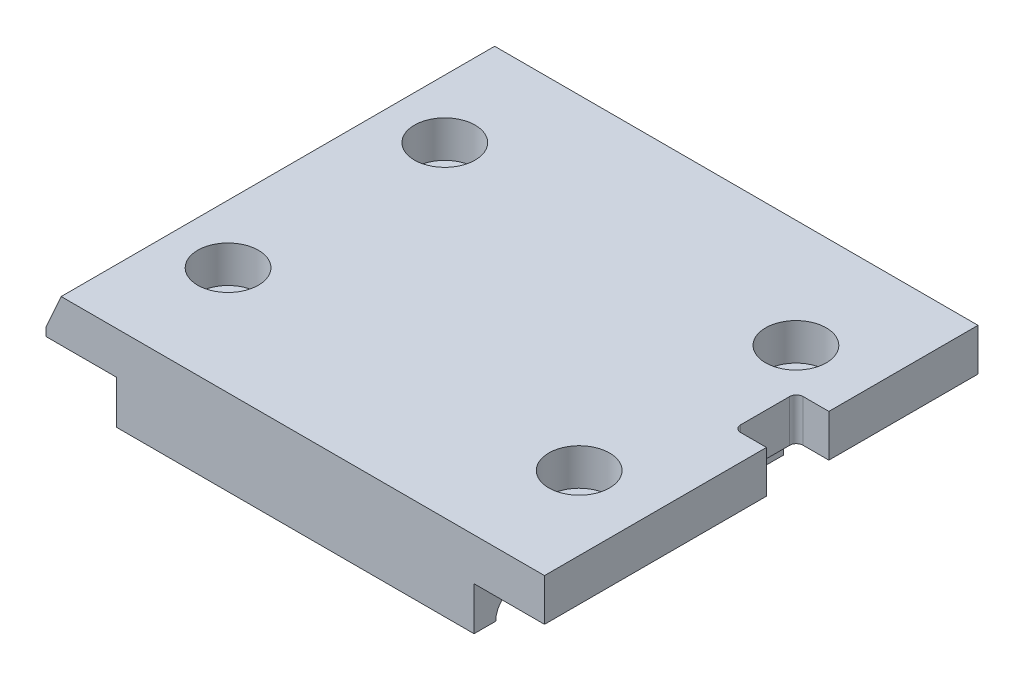
ISO-10303-21;
HEADER;
FILE_DESCRIPTION(('STEP AP214'),'2;1');
FILE_NAME('part.step','',(''),(''),'','','');
FILE_SCHEMA(('AUTOMOTIVE_DESIGN { 1 0 10303 214 1 1 1 1 }'));
ENDSEC;
DATA;
#1=APPLICATION_CONTEXT('core data for automotive mechanical design processes');
#2=APPLICATION_PROTOCOL_DEFINITION('international standard','automotive_design',2000,#1);
#3=PRODUCT_CONTEXT('',#1,'mechanical');
#4=PRODUCT('Part','Part','',(#3));
#5=PRODUCT_RELATED_PRODUCT_CATEGORY('part','',(#4));
#6=PRODUCT_DEFINITION_FORMATION('','',#4);
#7=PRODUCT_DEFINITION_CONTEXT('part definition',#1,'design');
#8=PRODUCT_DEFINITION('design','',#6,#7);
#9=PRODUCT_DEFINITION_SHAPE('','',#8);
#10=(LENGTH_UNIT() NAMED_UNIT(*) SI_UNIT(.MILLI.,.METRE.));
#11=(NAMED_UNIT(*) PLANE_ANGLE_UNIT() SI_UNIT($,.RADIAN.));
#12=(NAMED_UNIT(*) SI_UNIT($,.STERADIAN.) SOLID_ANGLE_UNIT());
#13=UNCERTAINTY_MEASURE_WITH_UNIT(LENGTH_MEASURE(1.E-05),#10,'distance_accuracy_value','');
#14=(GEOMETRIC_REPRESENTATION_CONTEXT(3) GLOBAL_UNCERTAINTY_ASSIGNED_CONTEXT((#13)) GLOBAL_UNIT_ASSIGNED_CONTEXT((#10,
#11,#12)) REPRESENTATION_CONTEXT('',''));
#15=CARTESIAN_POINT('',(0.,0.,0.));
#16=DIRECTION('',(0.,0.,1.));
#17=DIRECTION('',(1.,0.,0.));
#18=AXIS2_PLACEMENT_3D('',#15,#16,#17);
#19=CARTESIAN_POINT('',(23.,-36.1123422402632,-20.));
#20=DIRECTION('',(1.,0.,0.));
#21=DIRECTION('',(0.,0.,-1.));
#22=AXIS2_PLACEMENT_3D('',#19,#20,#21);
#23=PLANE('',#22);
#24=DIRECTION('',(0.,1.,0.));
#25=VECTOR('',#24,1.);
#26=CARTESIAN_POINT('',(23.,4.,-0.479999999999997));
#27=LINE('',#26,#25);
#28=CARTESIAN_POINT('',(23.,4.,-0.479999999999997));
#29=VERTEX_POINT('',#28);
#30=CARTESIAN_POINT('',(23.,7.9,-0.479999999999997));
#31=VERTEX_POINT('',#30);
#32=EDGE_CURVE('E293',#29,#31,#27,.T.);
#33=ORIENTED_EDGE('',*,*,#32,.T.);
#34=DIRECTION('',(0.,0.,-1.));
#35=VECTOR('',#34,1.);
#36=CARTESIAN_POINT('',(23.,7.9,-20.));
#37=LINE('',#36,#35);
#38=CARTESIAN_POINT('',(23.,7.9,20.));
#39=VERTEX_POINT('',#38);
#40=EDGE_CURVE('E311',#39,#31,#37,.T.);
#41=ORIENTED_EDGE('',*,*,#40,.F.);
#42=DIRECTION('',(0.,1.,0.));
#43=VECTOR('',#42,1.);
#44=CARTESIAN_POINT('',(23.,-36.1123422402632,20.));
#45=LINE('',#44,#43);
#46=CARTESIAN_POINT('',(23.,4.,20.));
#47=VERTEX_POINT('',#46);
#48=EDGE_CURVE('E303',#47,#39,#45,.T.);
#49=ORIENTED_EDGE('',*,*,#48,.F.);
#50=DIRECTION('',(0.,0.,-1.));
#51=VECTOR('',#50,1.);
#52=CARTESIAN_POINT('',(23.,4.,-20.));
#53=LINE('',#52,#51);
#54=EDGE_CURVE('E282',#47,#29,#53,.T.);
#55=ORIENTED_EDGE('',*,*,#54,.T.);
#56=EDGE_LOOP('',(#33,#41,#49,#55));
#57=FACE_BOUND('',#56,.T.);
#58=ADVANCED_FACE('F97',(#57),#23,.T.);
#59=CARTESIAN_POINT('',(0.,0.,0.));
#60=DIRECTION('',(0.,1.,0.));
#61=DIRECTION('',(0.,0.,1.));
#62=AXIS2_PLACEMENT_3D('',#59,#60,#61);
#63=PLANE('',#62);
#64=DIRECTION('',(0.,0.,-1.));
#65=VECTOR('',#64,1.);
#66=CARTESIAN_POINT('',(-16.5,0.,0.));
#67=LINE('',#66,#65);
#68=CARTESIAN_POINT('',(-16.5,0.,20.));
#69=VERTEX_POINT('',#68);
#70=CARTESIAN_POINT('',(-16.5,0.,18.));
#71=VERTEX_POINT('',#70);
#72=EDGE_CURVE('E456',#69,#71,#67,.T.);
#73=ORIENTED_EDGE('',*,*,#72,.T.);
#74=DIRECTION('',(1.,0.,0.));
#75=VECTOR('',#74,1.);
#76=CARTESIAN_POINT('',(-23.,0.,18.));
#77=LINE('',#76,#75);
#78=CARTESIAN_POINT('',(16.5,0.,18.));
#79=VERTEX_POINT('',#78);
#80=EDGE_CURVE('E512',#71,#79,#77,.T.);
#81=ORIENTED_EDGE('',*,*,#80,.T.);
#82=DIRECTION('',(0.,0.,-1.));
#83=VECTOR('',#82,1.);
#84=CARTESIAN_POINT('',(16.5,0.,-20.));
#85=LINE('',#84,#83);
#86=CARTESIAN_POINT('',(16.5,0.,20.));
#87=VERTEX_POINT('',#86);
#88=EDGE_CURVE('E362',#87,#79,#85,.T.);
#89=ORIENTED_EDGE('',*,*,#88,.F.);
#90=DIRECTION('',(-1.,0.,0.));
#91=VECTOR('',#90,1.);
#92=CARTESIAN_POINT('',(0.,0.,20.));
#93=LINE('',#92,#91);
#94=EDGE_CURVE('E405',#87,#69,#93,.T.);
#95=ORIENTED_EDGE('',*,*,#94,.T.);
#96=EDGE_LOOP('',(#73,#81,#89,#95));
#97=FACE_BOUND('',#96,.T.);
#98=ADVANCED_FACE('F551',(#97),#63,.F.);
#99=CARTESIAN_POINT('',(16.5,0.,14.));
#100=VERTEX_POINT('',#99);
#101=CARTESIAN_POINT('',(16.5,0.,11.4696938456699));
#102=VERTEX_POINT('',#101);
#103=EDGE_CURVE('E358',#100,#102,#85,.T.);
#104=ORIENTED_EDGE('',*,*,#103,.F.);
#105=DIRECTION('',(1.,0.,0.));
#106=VECTOR('',#105,1.);
#107=CARTESIAN_POINT('',(-23.,0.,14.));
#108=LINE('',#107,#106);
#109=CARTESIAN_POINT('',(-16.5,0.,14.));
#110=VERTEX_POINT('',#109);
#111=EDGE_CURVE('E300',#100,#110,#108,.F.);
#112=ORIENTED_EDGE('',*,*,#111,.T.);
#113=CARTESIAN_POINT('',(-16.5,0.,11.4696938456699));
#114=VERTEX_POINT('',#113);
#115=EDGE_CURVE('E460',#110,#114,#67,.T.);
#116=ORIENTED_EDGE('',*,*,#115,.T.);
#117=CARTESIAN_POINT('',(-16.2,0.,10.));
#118=DIRECTION('',(0.,1.,0.));
#119=DIRECTION('',(0.,0.,1.));
#120=AXIS2_PLACEMENT_3D('',#117,#118,#119);
#121=CIRCLE('',#120,1.50000000000001);
#122=CARTESIAN_POINT('',(-16.5,0.,8.53030615433009));
#123=VERTEX_POINT('',#122);
#124=EDGE_CURVE('E428',#123,#114,#121,.F.);
#125=ORIENTED_EDGE('',*,*,#124,.F.);
#126=CARTESIAN_POINT('',(-16.5,0.,-8.53030615433009));
#127=VERTEX_POINT('',#126);
#128=EDGE_CURVE('E455',#123,#127,#67,.T.);
#129=ORIENTED_EDGE('',*,*,#128,.T.);
#130=CARTESIAN_POINT('',(-16.2,0.,-10.));
#131=DIRECTION('',(0.,1.,0.));
#132=DIRECTION('',(0.,0.,1.));
#133=AXIS2_PLACEMENT_3D('',#130,#131,#132);
#134=CIRCLE('',#133,1.50000000000001);
#135=CARTESIAN_POINT('',(-16.5,0.,-11.4696938456699));
#136=VERTEX_POINT('',#135);
#137=EDGE_CURVE('E431',#136,#127,#134,.F.);
#138=ORIENTED_EDGE('',*,*,#137,.F.);
#139=DIRECTION('',(0.,0.,1.));
#140=VECTOR('',#139,1.);
#141=CARTESIAN_POINT('',(-16.5,0.,-20.));
#142=LINE('',#141,#140);
#143=CARTESIAN_POINT('',(-16.5,0.,-14.));
#144=VERTEX_POINT('',#143);
#145=EDGE_CURVE('E320',#144,#136,#142,.T.);
#146=ORIENTED_EDGE('',*,*,#145,.F.);
#147=DIRECTION('',(1.,0.,0.));
#148=VECTOR('',#147,1.);
#149=CARTESIAN_POINT('',(-23.,0.,-14.));
#150=LINE('',#149,#148);
#151=CARTESIAN_POINT('',(16.5,0.,-14.));
#152=VERTEX_POINT('',#151);
#153=EDGE_CURVE('E500',#144,#152,#150,.T.);
#154=ORIENTED_EDGE('',*,*,#153,.T.);
#155=DIRECTION('',(0.,0.,1.));
#156=VECTOR('',#155,1.);
#157=CARTESIAN_POINT('',(16.5,0.,0.));
#158=LINE('',#157,#156);
#159=CARTESIAN_POINT('',(16.5,0.,-11.4696938456699));
#160=VERTEX_POINT('',#159);
#161=EDGE_CURVE('E452',#152,#160,#158,.T.);
#162=ORIENTED_EDGE('',*,*,#161,.T.);
#163=CARTESIAN_POINT('',(16.2,0.,-10.));
#164=DIRECTION('',(0.,1.,0.));
#165=DIRECTION('',(0.,0.,1.));
#166=AXIS2_PLACEMENT_3D('',#163,#164,#165);
#167=CIRCLE('',#166,1.5);
#168=CARTESIAN_POINT('',(16.5,0.,-8.53030615433009));
#169=VERTEX_POINT('',#168);
#170=EDGE_CURVE('E410',#160,#169,#167,.T.);
#171=ORIENTED_EDGE('',*,*,#170,.T.);
#172=CARTESIAN_POINT('',(16.5,0.,8.53030615433009));
#173=VERTEX_POINT('',#172);
#174=EDGE_CURVE('E447',#169,#173,#158,.T.);
#175=ORIENTED_EDGE('',*,*,#174,.T.);
#176=CARTESIAN_POINT('',(16.2,0.,10.));
#177=DIRECTION('',(0.,1.,0.));
#178=DIRECTION('',(0.,0.,1.));
#179=AXIS2_PLACEMENT_3D('',#176,#177,#178);
#180=CIRCLE('',#179,1.5);
#181=EDGE_CURVE('E425',#173,#102,#180,.T.);
#182=ORIENTED_EDGE('',*,*,#181,.T.);
#183=EDGE_LOOP('',(#104,#112,#116,#125,#129,#138,#146,#154,#162,#171,#175,#182));
#184=FACE_BOUND('',#183,.T.);
#185=ADVANCED_FACE('F557',(#184),#63,.F.);
#186=CARTESIAN_POINT('',(0.,4.5,0.));
#187=DIRECTION('',(0.,1.,0.));
#188=DIRECTION('',(0.,0.,1.));
#189=AXIS2_PLACEMENT_3D('',#186,#187,#188);
#190=PLANE('',#189);
#191=CARTESIAN_POINT('',(-16.2,4.5,10.));
#192=DIRECTION('',(0.,1.,0.));
#193=DIRECTION('',(0.,0.,1.));
#194=AXIS2_PLACEMENT_3D('',#191,#192,#193);
#195=CIRCLE('',#194,1.50000000000001);
#196=CARTESIAN_POINT('',(-16.2,4.5,11.5));
#197=VERTEX_POINT('',#196);
#198=EDGE_CURVE('E409',#197,#197,#195,.F.);
#199=ORIENTED_EDGE('',*,*,#198,.T.);
#200=EDGE_LOOP('',(#199));
#201=FACE_BOUND('',#200,.T.);
#202=CARTESIAN_POINT('',(-16.2,4.5,10.));
#203=DIRECTION('',(0.,1.,0.));
#204=DIRECTION('',(0.,0.,1.));
#205=AXIS2_PLACEMENT_3D('',#202,#203,#204);
#206=CIRCLE('',#205,2.8);
#207=CARTESIAN_POINT('',(-16.2,4.5,12.8));
#208=VERTEX_POINT('',#207);
#209=EDGE_CURVE('E444',#208,#208,#206,.F.);
#210=ORIENTED_EDGE('',*,*,#209,.F.);
#211=EDGE_LOOP('',(#210));
#212=FACE_BOUND('',#211,.T.);
#213=ADVANCED_FACE('F735',(#201,#212),#190,.T.);
#214=CARTESIAN_POINT('',(-16.2,4.5,-10.));
#215=DIRECTION('',(0.,1.,0.));
#216=DIRECTION('',(0.,0.,1.));
#217=AXIS2_PLACEMENT_3D('',#214,#215,#216);
#218=CIRCLE('',#217,1.50000000000001);
#219=CARTESIAN_POINT('',(-16.2,4.5,-8.49999999999999));
#220=VERTEX_POINT('',#219);
#221=EDGE_CURVE('E413',#220,#220,#218,.F.);
#222=ORIENTED_EDGE('',*,*,#221,.T.);
#223=EDGE_LOOP('',(#222));
#224=FACE_BOUND('',#223,.T.);
#225=CARTESIAN_POINT('',(-16.2,4.5,-10.));
#226=DIRECTION('',(0.,1.,0.));
#227=DIRECTION('',(0.,0.,1.));
#228=AXIS2_PLACEMENT_3D('',#225,#226,#227);
#229=CIRCLE('',#228,2.8);
#230=CARTESIAN_POINT('',(-16.2,4.5,-7.2));
#231=VERTEX_POINT('',#230);
#232=EDGE_CURVE('E441',#231,#231,#229,.F.);
#233=ORIENTED_EDGE('',*,*,#232,.F.);
#234=EDGE_LOOP('',(#233));
#235=FACE_BOUND('',#234,.T.);
#236=ADVANCED_FACE('F861',(#224,#235),#190,.T.);
#237=CARTESIAN_POINT('',(16.2,4.5,-10.));
#238=DIRECTION('',(0.,1.,0.));
#239=DIRECTION('',(0.,0.,1.));
#240=AXIS2_PLACEMENT_3D('',#237,#238,#239);
#241=CIRCLE('',#240,1.5);
#242=CARTESIAN_POINT('',(16.2,4.5,-8.5));
#243=VERTEX_POINT('',#242);
#244=EDGE_CURVE('E416',#243,#243,#241,.T.);
#245=ORIENTED_EDGE('',*,*,#244,.F.);
#246=EDGE_LOOP('',(#245));
#247=FACE_BOUND('',#246,.T.);
#248=CARTESIAN_POINT('',(16.2,4.5,-10.));
#249=DIRECTION('',(0.,1.,0.));
#250=DIRECTION('',(0.,0.,1.));
#251=AXIS2_PLACEMENT_3D('',#248,#249,#250);
#252=CIRCLE('',#251,2.8);
#253=CARTESIAN_POINT('',(16.2,4.5,-7.19999999999999));
#254=VERTEX_POINT('',#253);
#255=EDGE_CURVE('E438',#254,#254,#252,.F.);
#256=ORIENTED_EDGE('',*,*,#255,.F.);
#257=EDGE_LOOP('',(#256));
#258=FACE_BOUND('',#257,.T.);
#259=ADVANCED_FACE('F914',(#247,#258),#190,.T.);
#260=CARTESIAN_POINT('',(16.2,4.5,10.));
#261=DIRECTION('',(0.,1.,0.));
#262=DIRECTION('',(0.,0.,1.));
#263=AXIS2_PLACEMENT_3D('',#260,#261,#262);
#264=CIRCLE('',#263,1.5);
#265=CARTESIAN_POINT('',(16.2,4.5,11.5));
#266=VERTEX_POINT('',#265);
#267=EDGE_CURVE('E406',#266,#266,#264,.T.);
#268=ORIENTED_EDGE('',*,*,#267,.F.);
#269=EDGE_LOOP('',(#268));
#270=FACE_BOUND('',#269,.T.);
#271=CARTESIAN_POINT('',(16.2,4.5,10.));
#272=DIRECTION('',(0.,1.,0.));
#273=DIRECTION('',(0.,0.,1.));
#274=AXIS2_PLACEMENT_3D('',#271,#272,#273);
#275=CIRCLE('',#274,2.8);
#276=CARTESIAN_POINT('',(16.2,4.5,12.8));
#277=VERTEX_POINT('',#276);
#278=EDGE_CURVE('E419',#277,#277,#275,.F.);
#279=ORIENTED_EDGE('',*,*,#278,.F.);
#280=EDGE_LOOP('',(#279));
#281=FACE_BOUND('',#280,.T.);
#282=ADVANCED_FACE('F786',(#270,#281),#190,.T.);
#283=CARTESIAN_POINT('',(0.,4.5,20.));
#284=DIRECTION('',(0.,0.,1.));
#285=DIRECTION('',(1.,0.,0.));
#286=AXIS2_PLACEMENT_3D('',#283,#284,#285);
#287=PLANE('',#286);
#288=DIRECTION('',(1.,0.,0.));
#289=VECTOR('',#288,1.);
#290=CARTESIAN_POINT('',(0.,7.9,20.));
#291=LINE('',#290,#289);
#292=CARTESIAN_POINT('',(-21.6,7.9,20.));
#293=VERTEX_POINT('',#292);
#294=EDGE_CURVE('E403',#293,#39,#291,.T.);
#295=ORIENTED_EDGE('',*,*,#294,.F.);
#296=DIRECTION('',(-0.406736643075801,-0.913545457642601,0.));
#297=VECTOR('',#296,1.);
#298=CARTESIAN_POINT('',(-19.2899567519872,13.0884420843458,20.));
#299=LINE('',#298,#297);
#300=CARTESIAN_POINT('',(-23.,4.7555485165341,20.));
#301=VERTEX_POINT('',#300);
#302=EDGE_CURVE('E119',#293,#301,#299,.T.);
#303=ORIENTED_EDGE('',*,*,#302,.T.);
#304=DIRECTION('',(0.,1.,0.));
#305=VECTOR('',#304,1.);
#306=CARTESIAN_POINT('',(-23.,-36.1123422402632,20.));
#307=LINE('',#306,#305);
#308=CARTESIAN_POINT('',(-23.,4.,20.));
#309=VERTEX_POINT('',#308);
#310=EDGE_CURVE('E318',#309,#301,#307,.T.);
#311=ORIENTED_EDGE('',*,*,#310,.F.);
#312=DIRECTION('',(-1.,0.,0.));
#313=VECTOR('',#312,1.);
#314=CARTESIAN_POINT('',(-20.,4.,20.));
#315=LINE('',#314,#313);
#316=CARTESIAN_POINT('',(-16.5,4.,20.));
#317=VERTEX_POINT('',#316);
#318=EDGE_CURVE('E330',#317,#309,#315,.T.);
#319=ORIENTED_EDGE('',*,*,#318,.F.);
#320=DIRECTION('',(0.,-1.,0.));
#321=VECTOR('',#320,1.);
#322=CARTESIAN_POINT('',(-16.5,4.,20.));
#323=LINE('',#322,#321);
#324=EDGE_CURVE('E336',#317,#69,#323,.T.);
#325=ORIENTED_EDGE('',*,*,#324,.T.);
#326=ORIENTED_EDGE('',*,*,#94,.F.);
#327=DIRECTION('',(0.,-1.,0.));
#328=VECTOR('',#327,1.);
#329=CARTESIAN_POINT('',(16.5,4.,20.));
#330=LINE('',#329,#328);
#331=CARTESIAN_POINT('',(16.5,4.,20.));
#332=VERTEX_POINT('',#331);
#333=EDGE_CURVE('E370',#332,#87,#330,.T.);
#334=ORIENTED_EDGE('',*,*,#333,.F.);
#335=DIRECTION('',(-1.,0.,0.));
#336=VECTOR('',#335,1.);
#337=CARTESIAN_POINT('',(20.,4.,20.));
#338=LINE('',#337,#336);
#339=EDGE_CURVE('E359',#47,#332,#338,.T.);
#340=ORIENTED_EDGE('',*,*,#339,.F.);
#341=ORIENTED_EDGE('',*,*,#48,.T.);
#342=EDGE_LOOP('',(#295,#303,#311,#319,#325,#326,#334,#340,#341));
#343=FACE_BOUND('',#342,.T.);
#344=ADVANCED_FACE('F493',(#343),#287,.T.);
#345=CARTESIAN_POINT('',(-16.2,4.5,-10.));
#346=DIRECTION('',(0.,-1.,0.));
#347=DIRECTION('',(0.,0.,-1.));
#348=AXIS2_PLACEMENT_3D('',#345,#346,#347);
#349=CYLINDRICAL_SURFACE('',#348,1.50000000000001);
#350=ORIENTED_EDGE('',*,*,#137,.T.);
#351=DIRECTION('',(0.,-1.,0.));
#352=VECTOR('',#351,1.);
#353=CARTESIAN_POINT('',(-16.5,4.5,-8.53030615433009));
#354=LINE('',#353,#352);
#355=CARTESIAN_POINT('',(-16.5,4.,-8.53030615433009));
#356=VERTEX_POINT('',#355);
#357=EDGE_CURVE('E349',#127,#356,#354,.F.);
#358=ORIENTED_EDGE('',*,*,#357,.T.);
#359=CARTESIAN_POINT('',(-16.2,4.,-10.));
#360=DIRECTION('',(0.,1.,0.));
#361=DIRECTION('',(0.,0.,1.));
#362=AXIS2_PLACEMENT_3D('',#359,#360,#361);
#363=CIRCLE('',#362,1.50000000000001);
#364=CARTESIAN_POINT('',(-16.5,4.,-11.4696938456699));
#365=VERTEX_POINT('',#364);
#366=EDGE_CURVE('E355',#356,#365,#363,.F.);
#367=ORIENTED_EDGE('',*,*,#366,.T.);
#368=DIRECTION('',(0.,-1.,0.));
#369=VECTOR('',#368,1.);
#370=CARTESIAN_POINT('',(-16.5,4.5,-11.4696938456699));
#371=LINE('',#370,#369);
#372=EDGE_CURVE('E346',#365,#136,#371,.T.);
#373=ORIENTED_EDGE('',*,*,#372,.T.);
#374=EDGE_LOOP('',(#350,#358,#367,#373));
#375=FACE_BOUND('',#374,.T.);
#376=ORIENTED_EDGE('',*,*,#221,.F.);
#377=EDGE_LOOP('',(#376));
#378=FACE_BOUND('',#377,.T.);
#379=ADVANCED_FACE('F641',(#375,#378),#349,.F.);
#380=CARTESIAN_POINT('',(-16.2,4.5,10.));
#381=DIRECTION('',(0.,-1.,0.));
#382=DIRECTION('',(0.,0.,-1.));
#383=AXIS2_PLACEMENT_3D('',#380,#381,#382);
#384=CYLINDRICAL_SURFACE('',#383,1.50000000000001);
#385=ORIENTED_EDGE('',*,*,#124,.T.);
#386=DIRECTION('',(0.,-1.,0.));
#387=VECTOR('',#386,1.);
#388=CARTESIAN_POINT('',(-16.5,4.5,11.4696938456699));
#389=LINE('',#388,#387);
#390=CARTESIAN_POINT('',(-16.5,4.,11.4696938456699));
#391=VERTEX_POINT('',#390);
#392=EDGE_CURVE('E343',#114,#391,#389,.F.);
#393=ORIENTED_EDGE('',*,*,#392,.T.);
#394=CARTESIAN_POINT('',(-16.2,4.,10.));
#395=DIRECTION('',(0.,1.,0.));
#396=DIRECTION('',(0.,0.,1.));
#397=AXIS2_PLACEMENT_3D('',#394,#395,#396);
#398=CIRCLE('',#397,1.50000000000001);
#399=CARTESIAN_POINT('',(-16.5,4.,8.53030615433009));
#400=VERTEX_POINT('',#399);
#401=EDGE_CURVE('E352',#391,#400,#398,.F.);
#402=ORIENTED_EDGE('',*,*,#401,.T.);
#403=DIRECTION('',(0.,-1.,0.));
#404=VECTOR('',#403,1.);
#405=CARTESIAN_POINT('',(-16.5,4.5,8.53030615433009));
#406=LINE('',#405,#404);
#407=EDGE_CURVE('E339',#400,#123,#406,.T.);
#408=ORIENTED_EDGE('',*,*,#407,.T.);
#409=EDGE_LOOP('',(#385,#393,#402,#408));
#410=FACE_BOUND('',#409,.T.);
#411=ORIENTED_EDGE('',*,*,#198,.F.);
#412=EDGE_LOOP('',(#411));
#413=FACE_BOUND('',#412,.T.);
#414=ADVANCED_FACE('F597',(#410,#413),#384,.F.);
#415=CARTESIAN_POINT('',(16.2,4.5,10.));
#416=DIRECTION('',(0.,-1.,0.));
#417=DIRECTION('',(0.,0.,-1.));
#418=AXIS2_PLACEMENT_3D('',#415,#416,#417);
#419=CYLINDRICAL_SURFACE('',#418,1.5);
#420=DIRECTION('',(0.,-1.,0.));
#421=VECTOR('',#420,1.);
#422=CARTESIAN_POINT('',(16.5,4.5,8.53030615433009));
#423=LINE('',#422,#421);
#424=CARTESIAN_POINT('',(16.5,4.,8.53030615433009));
#425=VERTEX_POINT('',#424);
#426=EDGE_CURVE('E384',#425,#173,#423,.T.);
#427=ORIENTED_EDGE('',*,*,#426,.F.);
#428=CARTESIAN_POINT('',(16.2,4.,10.));
#429=DIRECTION('',(0.,-1.,0.));
#430=DIRECTION('',(0.,0.,-1.));
#431=AXIS2_PLACEMENT_3D('',#428,#429,#430);
#432=CIRCLE('',#431,1.5);
#433=CARTESIAN_POINT('',(16.5,4.,11.4696938456699));
#434=VERTEX_POINT('',#433);
#435=EDGE_CURVE('E386',#425,#434,#432,.T.);
#436=ORIENTED_EDGE('',*,*,#435,.T.);
#437=DIRECTION('',(0.,-1.,0.));
#438=VECTOR('',#437,1.);
#439=CARTESIAN_POINT('',(16.5,4.5,11.4696938456699));
#440=LINE('',#439,#438);
#441=EDGE_CURVE('E382',#102,#434,#440,.F.);
#442=ORIENTED_EDGE('',*,*,#441,.F.);
#443=ORIENTED_EDGE('',*,*,#181,.F.);
#444=EDGE_LOOP('',(#427,#436,#442,#443));
#445=FACE_BOUND('',#444,.T.);
#446=ORIENTED_EDGE('',*,*,#267,.T.);
#447=EDGE_LOOP('',(#446));
#448=FACE_BOUND('',#447,.T.);
#449=ADVANCED_FACE('F611',(#445,#448),#419,.F.);
#450=CARTESIAN_POINT('',(0.,4.5,-20.));
#451=DIRECTION('',(0.,0.,1.));
#452=DIRECTION('',(1.,0.,0.));
#453=AXIS2_PLACEMENT_3D('',#450,#451,#452);
#454=PLANE('',#453);
#455=DIRECTION('',(0.,1.,0.));
#456=VECTOR('',#455,1.);
#457=CARTESIAN_POINT('',(-23.,-36.1123422402632,-20.));
#458=LINE('',#457,#456);
#459=CARTESIAN_POINT('',(-23.,4.,-20.));
#460=VERTEX_POINT('',#459);
#461=CARTESIAN_POINT('',(-23.,4.75554851653404,-20.));
#462=VERTEX_POINT('',#461);
#463=EDGE_CURVE('E308',#460,#462,#458,.T.);
#464=ORIENTED_EDGE('',*,*,#463,.T.);
#465=DIRECTION('',(0.406736643075801,0.913545457642601,0.));
#466=VECTOR('',#465,1.);
#467=CARTESIAN_POINT('',(-21.6,7.9,-20.));
#468=LINE('',#467,#466);
#469=CARTESIAN_POINT('',(-21.6,7.9,-20.));
#470=VERTEX_POINT('',#469);
#471=EDGE_CURVE('E12',#462,#470,#468,.T.);
#472=ORIENTED_EDGE('',*,*,#471,.T.);
#473=DIRECTION('',(1.,0.,0.));
#474=VECTOR('',#473,1.);
#475=CARTESIAN_POINT('',(0.,7.9,-20.));
#476=LINE('',#475,#474);
#477=CARTESIAN_POINT('',(23.,7.9,-20.));
#478=VERTEX_POINT('',#477);
#479=EDGE_CURVE('E401',#470,#478,#476,.T.);
#480=ORIENTED_EDGE('',*,*,#479,.T.);
#481=DIRECTION('',(0.,1.,0.));
#482=VECTOR('',#481,1.);
#483=CARTESIAN_POINT('',(23.,-36.1123422402632,-20.));
#484=LINE('',#483,#482);
#485=CARTESIAN_POINT('',(23.,4.,-20.));
#486=VERTEX_POINT('',#485);
#487=EDGE_CURVE('E304',#486,#478,#484,.T.);
#488=ORIENTED_EDGE('',*,*,#487,.F.);
#489=DIRECTION('',(1.,0.,0.));
#490=VECTOR('',#489,1.);
#491=CARTESIAN_POINT('',(20.,4.,-20.));
#492=LINE('',#491,#490);
#493=CARTESIAN_POINT('',(16.5,4.,-20.));
#494=VERTEX_POINT('',#493);
#495=EDGE_CURVE('E366',#494,#486,#492,.T.);
#496=ORIENTED_EDGE('',*,*,#495,.F.);
#497=DIRECTION('',(0.,-1.,0.));
#498=VECTOR('',#497,1.);
#499=CARTESIAN_POINT('',(16.5,4.,-20.));
#500=LINE('',#499,#498);
#501=CARTESIAN_POINT('',(16.5,0.,-20.));
#502=VERTEX_POINT('',#501);
#503=EDGE_CURVE('E373',#494,#502,#500,.T.);
#504=ORIENTED_EDGE('',*,*,#503,.T.);
#505=DIRECTION('',(-1.,0.,0.));
#506=VECTOR('',#505,1.);
#507=CARTESIAN_POINT('',(0.,0.,-20.));
#508=LINE('',#507,#506);
#509=CARTESIAN_POINT('',(-16.5,0.,-20.));
#510=VERTEX_POINT('',#509);
#511=EDGE_CURVE('E422',#502,#510,#508,.T.);
#512=ORIENTED_EDGE('',*,*,#511,.T.);
#513=DIRECTION('',(0.,-1.,0.));
#514=VECTOR('',#513,1.);
#515=CARTESIAN_POINT('',(-16.5,4.,-20.));
#516=LINE('',#515,#514);
#517=CARTESIAN_POINT('',(-16.5,4.,-20.));
#518=VERTEX_POINT('',#517);
#519=EDGE_CURVE('E333',#518,#510,#516,.T.);
#520=ORIENTED_EDGE('',*,*,#519,.F.);
#521=DIRECTION('',(1.,0.,0.));
#522=VECTOR('',#521,1.);
#523=CARTESIAN_POINT('',(-20.,4.,-20.));
#524=LINE('',#523,#522);
#525=EDGE_CURVE('E322',#460,#518,#524,.T.);
#526=ORIENTED_EDGE('',*,*,#525,.F.);
#527=EDGE_LOOP('',(#464,#472,#480,#488,#496,#504,#512,#520,#526));
#528=FACE_BOUND('',#527,.T.);
#529=ADVANCED_FACE('F631',(#528),#454,.F.);
#530=CARTESIAN_POINT('',(16.2,4.5,-10.));
#531=DIRECTION('',(0.,-1.,0.));
#532=DIRECTION('',(0.,0.,-1.));
#533=AXIS2_PLACEMENT_3D('',#530,#531,#532);
#534=CYLINDRICAL_SURFACE('',#533,1.5);
#535=DIRECTION('',(0.,-1.,0.));
#536=VECTOR('',#535,1.);
#537=CARTESIAN_POINT('',(16.5,4.5,-11.4696938456699));
#538=LINE('',#537,#536);
#539=CARTESIAN_POINT('',(16.5,4.,-11.4696938456699));
#540=VERTEX_POINT('',#539);
#541=EDGE_CURVE('E379',#540,#160,#538,.T.);
#542=ORIENTED_EDGE('',*,*,#541,.F.);
#543=CARTESIAN_POINT('',(16.2,4.,-10.));
#544=DIRECTION('',(0.,-1.,0.));
#545=DIRECTION('',(0.,0.,-1.));
#546=AXIS2_PLACEMENT_3D('',#543,#544,#545);
#547=CIRCLE('',#546,1.5);
#548=CARTESIAN_POINT('',(16.5,4.,-8.53030615433009));
#549=VERTEX_POINT('',#548);
#550=EDGE_CURVE('E451',#540,#549,#547,.T.);
#551=ORIENTED_EDGE('',*,*,#550,.T.);
#552=DIRECTION('',(0.,-1.,0.));
#553=VECTOR('',#552,1.);
#554=CARTESIAN_POINT('',(16.5,4.5,-8.53030615433009));
#555=LINE('',#554,#553);
#556=EDGE_CURVE('E376',#169,#549,#555,.F.);
#557=ORIENTED_EDGE('',*,*,#556,.F.);
#558=ORIENTED_EDGE('',*,*,#170,.F.);
#559=EDGE_LOOP('',(#542,#551,#557,#558));
#560=FACE_BOUND('',#559,.T.);
#561=ORIENTED_EDGE('',*,*,#244,.T.);
#562=EDGE_LOOP('',(#561));
#563=FACE_BOUND('',#562,.T.);
#564=ADVANCED_FACE('F625',(#560,#563),#534,.F.);
#565=CARTESIAN_POINT('',(16.5,0.,-18.));
#566=VERTEX_POINT('',#565);
#567=EDGE_CURVE('E448',#502,#566,#158,.T.);
#568=ORIENTED_EDGE('',*,*,#567,.T.);
#569=DIRECTION('',(1.,0.,0.));
#570=VECTOR('',#569,1.);
#571=CARTESIAN_POINT('',(-23.,0.,-18.));
#572=LINE('',#571,#570);
#573=CARTESIAN_POINT('',(-16.5,0.,-18.));
#574=VERTEX_POINT('',#573);
#575=EDGE_CURVE('E504',#566,#574,#572,.F.);
#576=ORIENTED_EDGE('',*,*,#575,.T.);
#577=EDGE_CURVE('E326',#510,#574,#142,.T.);
#578=ORIENTED_EDGE('',*,*,#577,.F.);
#579=ORIENTED_EDGE('',*,*,#511,.F.);
#580=EDGE_LOOP('',(#568,#576,#578,#579));
#581=FACE_BOUND('',#580,.T.);
#582=ADVANCED_FACE('F560',(#581),#63,.F.);
#583=CARTESIAN_POINT('',(0.,7.9,0.));
#584=DIRECTION('',(0.,-1.,0.));
#585=DIRECTION('',(0.,0.,-1.));
#586=AXIS2_PLACEMENT_3D('',#583,#584,#585);
#587=PLANE('',#586);
#588=ORIENTED_EDGE('',*,*,#479,.F.);
#589=DIRECTION('',(0.,0.,1.));
#590=VECTOR('',#589,1.);
#591=CARTESIAN_POINT('',(-21.6,7.9,20.));
#592=LINE('',#591,#590);
#593=EDGE_CURVE('E482',#470,#293,#592,.T.);
#594=ORIENTED_EDGE('',*,*,#593,.T.);
#595=ORIENTED_EDGE('',*,*,#294,.T.);
#596=ORIENTED_EDGE('',*,*,#40,.T.);
#597=DIRECTION('',(1.,0.,0.));
#598=VECTOR('',#597,1.);
#599=CARTESIAN_POINT('',(23.,7.9,-0.479999999999997));
#600=LINE('',#599,#598);
#601=CARTESIAN_POINT('',(20.62,7.9,-0.479999999999997));
#602=VERTEX_POINT('',#601);
#603=EDGE_CURVE('E296',#602,#31,#600,.T.);
#604=ORIENTED_EDGE('',*,*,#603,.F.);
#605=CARTESIAN_POINT('',(20.62,7.9,-1.1));
#606=DIRECTION('',(0.,-1.,0.));
#607=DIRECTION('',(0.,0.,-1.));
#608=AXIS2_PLACEMENT_3D('',#605,#606,#607);
#609=CIRCLE('',#608,0.62);
#610=CARTESIAN_POINT('',(20.,7.9,-1.1));
#611=VERTEX_POINT('',#610);
#612=EDGE_CURVE('E479',#602,#611,#609,.T.);
#613=ORIENTED_EDGE('',*,*,#612,.T.);
#614=DIRECTION('',(0.,0.,1.));
#615=VECTOR('',#614,1.);
#616=CARTESIAN_POINT('',(20.,7.9,-6.24));
#617=LINE('',#616,#615);
#618=CARTESIAN_POINT('',(20.,7.9,-5.62));
#619=VERTEX_POINT('',#618);
#620=EDGE_CURVE('E520',#619,#611,#617,.T.);
#621=ORIENTED_EDGE('',*,*,#620,.F.);
#622=CARTESIAN_POINT('',(20.62,7.9,-5.62));
#623=DIRECTION('',(0.,-1.,0.));
#624=DIRECTION('',(0.,0.,-1.));
#625=AXIS2_PLACEMENT_3D('',#622,#623,#624);
#626=CIRCLE('',#625,0.62);
#627=CARTESIAN_POINT('',(20.62,7.9,-6.24));
#628=VERTEX_POINT('',#627);
#629=EDGE_CURVE('E475',#619,#628,#626,.T.);
#630=ORIENTED_EDGE('',*,*,#629,.T.);
#631=DIRECTION('',(-1.,0.,0.));
#632=VECTOR('',#631,1.);
#633=CARTESIAN_POINT('',(23.,7.9,-6.24));
#634=LINE('',#633,#632);
#635=CARTESIAN_POINT('',(23.,7.9,-6.24));
#636=VERTEX_POINT('',#635);
#637=EDGE_CURVE('E523',#636,#628,#634,.T.);
#638=ORIENTED_EDGE('',*,*,#637,.F.);
#639=EDGE_CURVE('E495',#636,#478,#37,.T.);
#640=ORIENTED_EDGE('',*,*,#639,.T.);
#641=EDGE_LOOP('',(#588,#594,#595,#596,#604,#613,#621,#630,#638,#640));
#642=FACE_BOUND('',#641,.T.);
#643=CARTESIAN_POINT('',(-16.2,7.9,10.));
#644=DIRECTION('',(0.,1.,0.));
#645=DIRECTION('',(0.,0.,1.));
#646=AXIS2_PLACEMENT_3D('',#643,#644,#645);
#647=CIRCLE('',#646,2.8);
#648=CARTESIAN_POINT('',(-16.2,7.9,12.8));
#649=VERTEX_POINT('',#648);
#650=EDGE_CURVE('E398',#649,#649,#647,.T.);
#651=ORIENTED_EDGE('',*,*,#650,.F.);
#652=EDGE_LOOP('',(#651));
#653=FACE_BOUND('',#652,.T.);
#654=CARTESIAN_POINT('',(-16.2,7.9,-10.));
#655=DIRECTION('',(0.,1.,0.));
#656=DIRECTION('',(0.,0.,1.));
#657=AXIS2_PLACEMENT_3D('',#654,#655,#656);
#658=CIRCLE('',#657,2.8);
#659=CARTESIAN_POINT('',(-16.2,7.9,-7.2));
#660=VERTEX_POINT('',#659);
#661=EDGE_CURVE('E395',#660,#660,#658,.T.);
#662=ORIENTED_EDGE('',*,*,#661,.F.);
#663=EDGE_LOOP('',(#662));
#664=FACE_BOUND('',#663,.T.);
#665=CARTESIAN_POINT('',(16.2,7.9,-10.));
#666=DIRECTION('',(0.,1.,0.));
#667=DIRECTION('',(0.,0.,1.));
#668=AXIS2_PLACEMENT_3D('',#665,#666,#667);
#669=CIRCLE('',#668,2.8);
#670=CARTESIAN_POINT('',(16.2,7.9,-7.19999999999999));
#671=VERTEX_POINT('',#670);
#672=EDGE_CURVE('E392',#671,#671,#669,.T.);
#673=ORIENTED_EDGE('',*,*,#672,.F.);
#674=EDGE_LOOP('',(#673));
#675=FACE_BOUND('',#674,.T.);
#676=CARTESIAN_POINT('',(16.2,7.9,10.));
#677=DIRECTION('',(0.,1.,0.));
#678=DIRECTION('',(0.,0.,1.));
#679=AXIS2_PLACEMENT_3D('',#676,#677,#678);
#680=CIRCLE('',#679,2.8);
#681=CARTESIAN_POINT('',(16.2,7.9,12.8));
#682=VERTEX_POINT('',#681);
#683=EDGE_CURVE('E389',#682,#682,#680,.T.);
#684=ORIENTED_EDGE('',*,*,#683,.F.);
#685=EDGE_LOOP('',(#684));
#686=FACE_BOUND('',#685,.T.);
#687=ADVANCED_FACE('F488',(#642,#653,#664,#675,#686),#587,.F.);
#688=CARTESIAN_POINT('',(-16.2,7.9,10.));
#689=DIRECTION('',(0.,-1.,0.));
#690=DIRECTION('',(0.,0.,-1.));
#691=AXIS2_PLACEMENT_3D('',#688,#689,#690);
#692=CYLINDRICAL_SURFACE('',#691,2.8);
#693=ORIENTED_EDGE('',*,*,#650,.T.);
#694=EDGE_LOOP('',(#693));
#695=FACE_BOUND('',#694,.T.);
#696=ORIENTED_EDGE('',*,*,#209,.T.);
#697=EDGE_LOOP('',(#696));
#698=FACE_BOUND('',#697,.T.);
#699=ADVANCED_FACE('F812',(#695,#698),#692,.F.);
#700=CARTESIAN_POINT('',(-16.2,7.9,-10.));
#701=DIRECTION('',(0.,-1.,0.));
#702=DIRECTION('',(0.,0.,-1.));
#703=AXIS2_PLACEMENT_3D('',#700,#701,#702);
#704=CYLINDRICAL_SURFACE('',#703,2.8);
#705=ORIENTED_EDGE('',*,*,#661,.T.);
#706=EDGE_LOOP('',(#705));
#707=FACE_BOUND('',#706,.T.);
#708=ORIENTED_EDGE('',*,*,#232,.T.);
#709=EDGE_LOOP('',(#708));
#710=FACE_BOUND('',#709,.T.);
#711=ADVANCED_FACE('F853',(#707,#710),#704,.F.);
#712=CARTESIAN_POINT('',(16.2,7.9,-10.));
#713=DIRECTION('',(0.,-1.,0.));
#714=DIRECTION('',(0.,0.,-1.));
#715=AXIS2_PLACEMENT_3D('',#712,#713,#714);
#716=CYLINDRICAL_SURFACE('',#715,2.8);
#717=ORIENTED_EDGE('',*,*,#672,.T.);
#718=EDGE_LOOP('',(#717));
#719=FACE_BOUND('',#718,.T.);
#720=ORIENTED_EDGE('',*,*,#255,.T.);
#721=EDGE_LOOP('',(#720));
#722=FACE_BOUND('',#721,.T.);
#723=ADVANCED_FACE('F849',(#719,#722),#716,.F.);
#724=CARTESIAN_POINT('',(16.2,7.9,10.));
#725=DIRECTION('',(0.,-1.,0.));
#726=DIRECTION('',(0.,0.,-1.));
#727=AXIS2_PLACEMENT_3D('',#724,#725,#726);
#728=CYLINDRICAL_SURFACE('',#727,2.8);
#729=ORIENTED_EDGE('',*,*,#683,.T.);
#730=EDGE_LOOP('',(#729));
#731=FACE_BOUND('',#730,.T.);
#732=ORIENTED_EDGE('',*,*,#278,.T.);
#733=EDGE_LOOP('',(#732));
#734=FACE_BOUND('',#733,.T.);
#735=ADVANCED_FACE('F846',(#731,#734),#728,.F.);
#736=CARTESIAN_POINT('',(16.5,4.,-20.));
#737=DIRECTION('',(-1.,0.,0.));
#738=DIRECTION('',(0.,0.,1.));
#739=AXIS2_PLACEMENT_3D('',#736,#737,#738);
#740=PLANE('',#739);
#741=ORIENTED_EDGE('',*,*,#426,.T.);
#742=ORIENTED_EDGE('',*,*,#174,.F.);
#743=ORIENTED_EDGE('',*,*,#556,.T.);
#744=DIRECTION('',(0.,0.,-1.));
#745=VECTOR('',#744,1.);
#746=CARTESIAN_POINT('',(16.5,4.,-20.));
#747=LINE('',#746,#745);
#748=EDGE_CURVE('E367',#425,#549,#747,.T.);
#749=ORIENTED_EDGE('',*,*,#748,.F.);
#750=EDGE_LOOP('',(#741,#742,#743,#749));
#751=FACE_BOUND('',#750,.T.);
#752=ADVANCED_FACE('F616',(#751),#740,.F.);
#753=ORIENTED_EDGE('',*,*,#161,.F.);
#754=CARTESIAN_POINT('',(16.5,0.,-16.));
#755=DIRECTION('',(-1.,0.,0.));
#756=DIRECTION('',(0.,0.,1.));
#757=AXIS2_PLACEMENT_3D('',#754,#755,#756);
#758=CIRCLE('',#757,2.);
#759=EDGE_CURVE('E496',#152,#566,#758,.T.);
#760=ORIENTED_EDGE('',*,*,#759,.T.);
#761=ORIENTED_EDGE('',*,*,#567,.F.);
#762=ORIENTED_EDGE('',*,*,#503,.F.);
#763=EDGE_CURVE('E361',#540,#494,#747,.T.);
#764=ORIENTED_EDGE('',*,*,#763,.F.);
#765=ORIENTED_EDGE('',*,*,#541,.T.);
#766=EDGE_LOOP('',(#753,#760,#761,#762,#764,#765));
#767=FACE_BOUND('',#766,.T.);
#768=ADVANCED_FACE('F622',(#767),#740,.F.);
#769=ORIENTED_EDGE('',*,*,#88,.T.);
#770=CARTESIAN_POINT('',(16.5,0.,16.));
#771=DIRECTION('',(-1.,0.,0.));
#772=DIRECTION('',(0.,0.,1.));
#773=AXIS2_PLACEMENT_3D('',#770,#771,#772);
#774=CIRCLE('',#773,2.);
#775=EDGE_CURVE('E509',#79,#100,#774,.T.);
#776=ORIENTED_EDGE('',*,*,#775,.T.);
#777=ORIENTED_EDGE('',*,*,#103,.T.);
#778=ORIENTED_EDGE('',*,*,#441,.T.);
#779=EDGE_CURVE('E363',#332,#434,#747,.T.);
#780=ORIENTED_EDGE('',*,*,#779,.F.);
#781=ORIENTED_EDGE('',*,*,#333,.T.);
#782=EDGE_LOOP('',(#769,#776,#777,#778,#780,#781));
#783=FACE_BOUND('',#782,.T.);
#784=ADVANCED_FACE('F605',(#783),#740,.F.);
#785=CARTESIAN_POINT('',(0.,4.,0.));
#786=DIRECTION('',(0.,-1.,0.));
#787=DIRECTION('',(0.,0.,-1.));
#788=AXIS2_PLACEMENT_3D('',#785,#786,#787);
#789=PLANE('',#788);
#790=DIRECTION('',(0.,0.,1.));
#791=VECTOR('',#790,1.);
#792=CARTESIAN_POINT('',(20.,4.,-6.24));
#793=LINE('',#792,#791);
#794=CARTESIAN_POINT('',(20.,4.,-5.62));
#795=VERTEX_POINT('',#794);
#796=CARTESIAN_POINT('',(20.,4.,-1.1));
#797=VERTEX_POINT('',#796);
#798=EDGE_CURVE('E290',#795,#797,#793,.T.);
#799=ORIENTED_EDGE('',*,*,#798,.T.);
#800=CARTESIAN_POINT('',(20.62,4.,-1.1));
#801=DIRECTION('',(0.,-1.,0.));
#802=DIRECTION('',(0.,0.,-1.));
#803=AXIS2_PLACEMENT_3D('',#800,#801,#802);
#804=CIRCLE('',#803,0.62);
#805=CARTESIAN_POINT('',(20.62,4.,-0.479999999999997));
#806=VERTEX_POINT('',#805);
#807=EDGE_CURVE('E285',#797,#806,#804,.F.);
#808=ORIENTED_EDGE('',*,*,#807,.T.);
#809=DIRECTION('',(1.,0.,0.));
#810=VECTOR('',#809,1.);
#811=CARTESIAN_POINT('',(23.,4.,-0.479999999999997));
#812=LINE('',#811,#810);
#813=EDGE_CURVE('E276',#806,#29,#812,.T.);
#814=ORIENTED_EDGE('',*,*,#813,.T.);
#815=ORIENTED_EDGE('',*,*,#54,.F.);
#816=ORIENTED_EDGE('',*,*,#339,.T.);
#817=ORIENTED_EDGE('',*,*,#779,.T.);
#818=ORIENTED_EDGE('',*,*,#435,.F.);
#819=ORIENTED_EDGE('',*,*,#748,.T.);
#820=ORIENTED_EDGE('',*,*,#550,.F.);
#821=ORIENTED_EDGE('',*,*,#763,.T.);
#822=ORIENTED_EDGE('',*,*,#495,.T.);
#823=CARTESIAN_POINT('',(23.,4.,-6.24));
#824=VERTEX_POINT('',#823);
#825=EDGE_CURVE('E305',#824,#486,#53,.T.);
#826=ORIENTED_EDGE('',*,*,#825,.F.);
#827=DIRECTION('',(-1.,0.,0.));
#828=VECTOR('',#827,1.);
#829=CARTESIAN_POINT('',(23.,4.,-6.24));
#830=LINE('',#829,#828);
#831=CARTESIAN_POINT('',(20.62,4.,-6.24));
#832=VERTEX_POINT('',#831);
#833=EDGE_CURVE('E519',#824,#832,#830,.T.);
#834=ORIENTED_EDGE('',*,*,#833,.T.);
#835=CARTESIAN_POINT('',(20.62,4.,-5.62));
#836=DIRECTION('',(0.,-1.,0.));
#837=DIRECTION('',(0.,0.,-1.));
#838=AXIS2_PLACEMENT_3D('',#835,#836,#837);
#839=CIRCLE('',#838,0.62);
#840=EDGE_CURVE('E477',#832,#795,#839,.F.);
#841=ORIENTED_EDGE('',*,*,#840,.T.);
#842=EDGE_LOOP('',(#799,#808,#814,#815,#816,#817,#818,#819,#820,#821,#822,#826,#834,#841));
#843=FACE_BOUND('',#842,.T.);
#844=ADVANCED_FACE('F279',(#843),#789,.T.);
#845=CARTESIAN_POINT('',(0.,4.,0.));
#846=DIRECTION('',(0.,1.,0.));
#847=DIRECTION('',(0.,0.,1.));
#848=AXIS2_PLACEMENT_3D('',#845,#846,#847);
#849=PLANE('',#848);
#850=DIRECTION('',(0.,0.,1.));
#851=VECTOR('',#850,1.);
#852=CARTESIAN_POINT('',(-16.5,4.,-20.));
#853=LINE('',#852,#851);
#854=EDGE_CURVE('E331',#356,#400,#853,.T.);
#855=ORIENTED_EDGE('',*,*,#854,.T.);
#856=ORIENTED_EDGE('',*,*,#401,.F.);
#857=EDGE_CURVE('E325',#391,#317,#853,.T.);
#858=ORIENTED_EDGE('',*,*,#857,.T.);
#859=ORIENTED_EDGE('',*,*,#318,.T.);
#860=DIRECTION('',(0.,0.,1.));
#861=VECTOR('',#860,1.);
#862=CARTESIAN_POINT('',(-23.,4.,-20.));
#863=LINE('',#862,#861);
#864=EDGE_CURVE('E315',#460,#309,#863,.T.);
#865=ORIENTED_EDGE('',*,*,#864,.F.);
#866=ORIENTED_EDGE('',*,*,#525,.T.);
#867=EDGE_CURVE('E327',#518,#365,#853,.T.);
#868=ORIENTED_EDGE('',*,*,#867,.T.);
#869=ORIENTED_EDGE('',*,*,#366,.F.);
#870=EDGE_LOOP('',(#855,#856,#858,#859,#865,#866,#868,#869));
#871=FACE_BOUND('',#870,.T.);
#872=ADVANCED_FACE('F635',(#871),#849,.F.);
#873=CARTESIAN_POINT('',(-16.5,4.,-20.));
#874=DIRECTION('',(1.,0.,0.));
#875=DIRECTION('',(0.,0.,-1.));
#876=AXIS2_PLACEMENT_3D('',#873,#874,#875);
#877=PLANE('',#876);
#878=ORIENTED_EDGE('',*,*,#128,.F.);
#879=ORIENTED_EDGE('',*,*,#407,.F.);
#880=ORIENTED_EDGE('',*,*,#854,.F.);
#881=ORIENTED_EDGE('',*,*,#357,.F.);
#882=EDGE_LOOP('',(#878,#879,#880,#881));
#883=FACE_BOUND('',#882,.T.);
#884=ADVANCED_FACE('F645',(#883),#877,.F.);
#885=ORIENTED_EDGE('',*,*,#577,.T.);
#886=CARTESIAN_POINT('',(-16.5,0.,-16.));
#887=DIRECTION('',(1.,0.,0.));
#888=DIRECTION('',(0.,0.,-1.));
#889=AXIS2_PLACEMENT_3D('',#886,#887,#888);
#890=CIRCLE('',#889,2.);
#891=EDGE_CURVE('E459',#574,#144,#890,.T.);
#892=ORIENTED_EDGE('',*,*,#891,.T.);
#893=ORIENTED_EDGE('',*,*,#145,.T.);
#894=ORIENTED_EDGE('',*,*,#372,.F.);
#895=ORIENTED_EDGE('',*,*,#867,.F.);
#896=ORIENTED_EDGE('',*,*,#519,.T.);
#897=EDGE_LOOP('',(#885,#892,#893,#894,#895,#896));
#898=FACE_BOUND('',#897,.T.);
#899=ADVANCED_FACE('F638',(#898),#877,.F.);
#900=ORIENTED_EDGE('',*,*,#115,.F.);
#901=CARTESIAN_POINT('',(-16.5,0.,16.));
#902=DIRECTION('',(1.,0.,0.));
#903=DIRECTION('',(0.,0.,-1.));
#904=AXIS2_PLACEMENT_3D('',#901,#902,#903);
#905=CIRCLE('',#904,2.);
#906=EDGE_CURVE('E463',#110,#71,#905,.T.);
#907=ORIENTED_EDGE('',*,*,#906,.T.);
#908=ORIENTED_EDGE('',*,*,#72,.F.);
#909=ORIENTED_EDGE('',*,*,#324,.F.);
#910=ORIENTED_EDGE('',*,*,#857,.F.);
#911=ORIENTED_EDGE('',*,*,#392,.F.);
#912=EDGE_LOOP('',(#900,#907,#908,#909,#910,#911));
#913=FACE_BOUND('',#912,.T.);
#914=ADVANCED_FACE('F573',(#913),#877,.F.);
#915=CARTESIAN_POINT('',(-23.,-36.1123422402632,-20.));
#916=DIRECTION('',(-1.,0.,0.));
#917=DIRECTION('',(0.,0.,1.));
#918=AXIS2_PLACEMENT_3D('',#915,#916,#917);
#919=PLANE('',#918);
#920=ORIENTED_EDGE('',*,*,#310,.T.);
#921=DIRECTION('',(0.,0.,-1.));
#922=VECTOR('',#921,1.);
#923=CARTESIAN_POINT('',(-23.,4.7555485165341,-20.));
#924=LINE('',#923,#922);
#925=EDGE_CURVE('E105',#301,#462,#924,.T.);
#926=ORIENTED_EDGE('',*,*,#925,.T.);
#927=ORIENTED_EDGE('',*,*,#463,.F.);
#928=ORIENTED_EDGE('',*,*,#864,.T.);
#929=EDGE_LOOP('',(#920,#926,#927,#928));
#930=FACE_BOUND('',#929,.T.);
#931=ADVANCED_FACE('F565',(#930),#919,.T.);
#932=DIRECTION('',(0.,1.,0.));
#933=VECTOR('',#932,1.);
#934=CARTESIAN_POINT('',(23.,4.,-6.24));
#935=LINE('',#934,#933);
#936=EDGE_CURVE('E289',#824,#636,#935,.T.);
#937=ORIENTED_EDGE('',*,*,#936,.F.);
#938=ORIENTED_EDGE('',*,*,#825,.T.);
#939=ORIENTED_EDGE('',*,*,#487,.T.);
#940=ORIENTED_EDGE('',*,*,#639,.F.);
#941=EDGE_LOOP('',(#937,#938,#939,#940));
#942=FACE_BOUND('',#941,.T.);
#943=ADVANCED_FACE('F553',(#942),#23,.T.);
#944=CARTESIAN_POINT('',(-23.,0.,-16.));
#945=DIRECTION('',(1.,0.,0.));
#946=DIRECTION('',(0.,0.,-1.));
#947=AXIS2_PLACEMENT_3D('',#944,#945,#946);
#948=CYLINDRICAL_SURFACE('',#947,2.);
#949=ORIENTED_EDGE('',*,*,#153,.F.);
#950=ORIENTED_EDGE('',*,*,#891,.F.);
#951=ORIENTED_EDGE('',*,*,#575,.F.);
#952=ORIENTED_EDGE('',*,*,#759,.F.);
#953=EDGE_LOOP('',(#949,#950,#951,#952));
#954=FACE_BOUND('',#953,.T.);
#955=ADVANCED_FACE('F564',(#954),#948,.F.);
#956=CARTESIAN_POINT('',(-23.,0.,16.));
#957=DIRECTION('',(1.,0.,0.));
#958=DIRECTION('',(0.,0.,-1.));
#959=AXIS2_PLACEMENT_3D('',#956,#957,#958);
#960=CYLINDRICAL_SURFACE('',#959,2.);
#961=ORIENTED_EDGE('',*,*,#80,.F.);
#962=ORIENTED_EDGE('',*,*,#906,.F.);
#963=ORIENTED_EDGE('',*,*,#111,.F.);
#964=ORIENTED_EDGE('',*,*,#775,.F.);
#965=EDGE_LOOP('',(#961,#962,#963,#964));
#966=FACE_BOUND('',#965,.T.);
#967=ADVANCED_FACE('F571',(#966),#960,.F.);
#968=CARTESIAN_POINT('',(23.,4.,-0.479999999999997));
#969=DIRECTION('',(0.,0.,1.));
#970=DIRECTION('',(1.,0.,0.));
#971=AXIS2_PLACEMENT_3D('',#968,#969,#970);
#972=PLANE('',#971);
#973=ORIENTED_EDGE('',*,*,#813,.F.);
#974=DIRECTION('',(0.,1.,0.));
#975=VECTOR('',#974,1.);
#976=CARTESIAN_POINT('',(20.62,7.9,-0.479999999999997));
#977=LINE('',#976,#975);
#978=EDGE_CURVE('E473',#806,#602,#977,.T.);
#979=ORIENTED_EDGE('',*,*,#978,.T.);
#980=ORIENTED_EDGE('',*,*,#603,.T.);
#981=ORIENTED_EDGE('',*,*,#32,.F.);
#982=EDGE_LOOP('',(#973,#979,#980,#981));
#983=FACE_BOUND('',#982,.T.);
#984=ADVANCED_FACE('F294',(#983),#972,.F.);
#985=CARTESIAN_POINT('',(20.,4.,-6.24));
#986=DIRECTION('',(-1.,0.,0.));
#987=DIRECTION('',(0.,0.,1.));
#988=AXIS2_PLACEMENT_3D('',#985,#986,#987);
#989=PLANE('',#988);
#990=ORIENTED_EDGE('',*,*,#798,.F.);
#991=DIRECTION('',(0.,1.,0.));
#992=VECTOR('',#991,1.);
#993=CARTESIAN_POINT('',(20.,7.9,-5.62));
#994=LINE('',#993,#992);
#995=EDGE_CURVE('E468',#795,#619,#994,.T.);
#996=ORIENTED_EDGE('',*,*,#995,.T.);
#997=ORIENTED_EDGE('',*,*,#620,.T.);
#998=DIRECTION('',(0.,1.,0.));
#999=VECTOR('',#998,1.);
#1000=CARTESIAN_POINT('',(20.,4.,-1.1));
#1001=LINE('',#1000,#999);
#1002=EDGE_CURVE('E466',#611,#797,#1001,.F.);
#1003=ORIENTED_EDGE('',*,*,#1002,.T.);
#1004=EDGE_LOOP('',(#990,#996,#997,#1003));
#1005=FACE_BOUND('',#1004,.T.);
#1006=ADVANCED_FACE('F539',(#1005),#989,.F.);
#1007=CARTESIAN_POINT('',(23.,4.,-6.24));
#1008=DIRECTION('',(0.,0.,-1.));
#1009=DIRECTION('',(-1.,0.,0.));
#1010=AXIS2_PLACEMENT_3D('',#1007,#1008,#1009);
#1011=PLANE('',#1010);
#1012=ORIENTED_EDGE('',*,*,#637,.T.);
#1013=DIRECTION('',(0.,1.,0.));
#1014=VECTOR('',#1013,1.);
#1015=CARTESIAN_POINT('',(20.62,4.,-6.24));
#1016=LINE('',#1015,#1014);
#1017=EDGE_CURVE('E471',#628,#832,#1016,.F.);
#1018=ORIENTED_EDGE('',*,*,#1017,.T.);
#1019=ORIENTED_EDGE('',*,*,#833,.F.);
#1020=ORIENTED_EDGE('',*,*,#936,.T.);
#1021=EDGE_LOOP('',(#1012,#1018,#1019,#1020));
#1022=FACE_BOUND('',#1021,.T.);
#1023=ADVANCED_FACE('F548',(#1022),#1011,.F.);
#1024=CARTESIAN_POINT('',(20.62,4.,-5.62));
#1025=DIRECTION('',(0.,-1.,0.));
#1026=DIRECTION('',(0.,0.,-1.));
#1027=AXIS2_PLACEMENT_3D('',#1024,#1025,#1026);
#1028=CYLINDRICAL_SURFACE('',#1027,0.62);
#1029=ORIENTED_EDGE('',*,*,#840,.F.);
#1030=ORIENTED_EDGE('',*,*,#1017,.F.);
#1031=ORIENTED_EDGE('',*,*,#629,.F.);
#1032=ORIENTED_EDGE('',*,*,#995,.F.);
#1033=EDGE_LOOP('',(#1029,#1030,#1031,#1032));
#1034=FACE_BOUND('',#1033,.T.);
#1035=ADVANCED_FACE('F536',(#1034),#1028,.F.);
#1036=CARTESIAN_POINT('',(20.62,4.,-1.1));
#1037=DIRECTION('',(0.,-1.,0.));
#1038=DIRECTION('',(0.,0.,-1.));
#1039=AXIS2_PLACEMENT_3D('',#1036,#1037,#1038);
#1040=CYLINDRICAL_SURFACE('',#1039,0.62);
#1041=ORIENTED_EDGE('',*,*,#807,.F.);
#1042=ORIENTED_EDGE('',*,*,#1002,.F.);
#1043=ORIENTED_EDGE('',*,*,#612,.F.);
#1044=ORIENTED_EDGE('',*,*,#978,.F.);
#1045=EDGE_LOOP('',(#1041,#1042,#1043,#1044));
#1046=FACE_BOUND('',#1045,.T.);
#1047=ADVANCED_FACE('F542',(#1046),#1040,.F.);
#1048=CARTESIAN_POINT('',(-21.6,7.9,0.));
#1049=DIRECTION('',(-0.9135454576426,0.406736643075801,0.));
#1050=DIRECTION('',(0.,0.,-1.));
#1051=AXIS2_PLACEMENT_3D('',#1048,#1049,#1050);
#1052=PLANE('',#1051);
#1053=ORIENTED_EDGE('',*,*,#471,.F.);
#1054=ORIENTED_EDGE('',*,*,#925,.F.);
#1055=ORIENTED_EDGE('',*,*,#302,.F.);
#1056=ORIENTED_EDGE('',*,*,#593,.F.);
#1057=EDGE_LOOP('',(#1053,#1054,#1055,#1056));
#1058=FACE_BOUND('',#1057,.T.);
#1059=ADVANCED_FACE('F99',(#1058),#1052,.T.);
#1060=CLOSED_SHELL('',(#58,#98,#185,#213,#236,#259,#282,#344,#379,#414,#449,#529,#564,#582,#687,
#699,#711,#723,#735,#752,#768,#784,#844,#872,#884,#899,#914,#931,#943,#955,#967,#984,#1006,
#1023,#1035,#1047,#1059));
#1061=MANIFOLD_SOLID_BREP('B2',#1060);
#1062=ADVANCED_BREP_SHAPE_REPRESENTATION('',(#18,#1061),#14);
#1063=SHAPE_DEFINITION_REPRESENTATION(#9,#1062);
ENDSEC;
END-ISO-10303-21;
